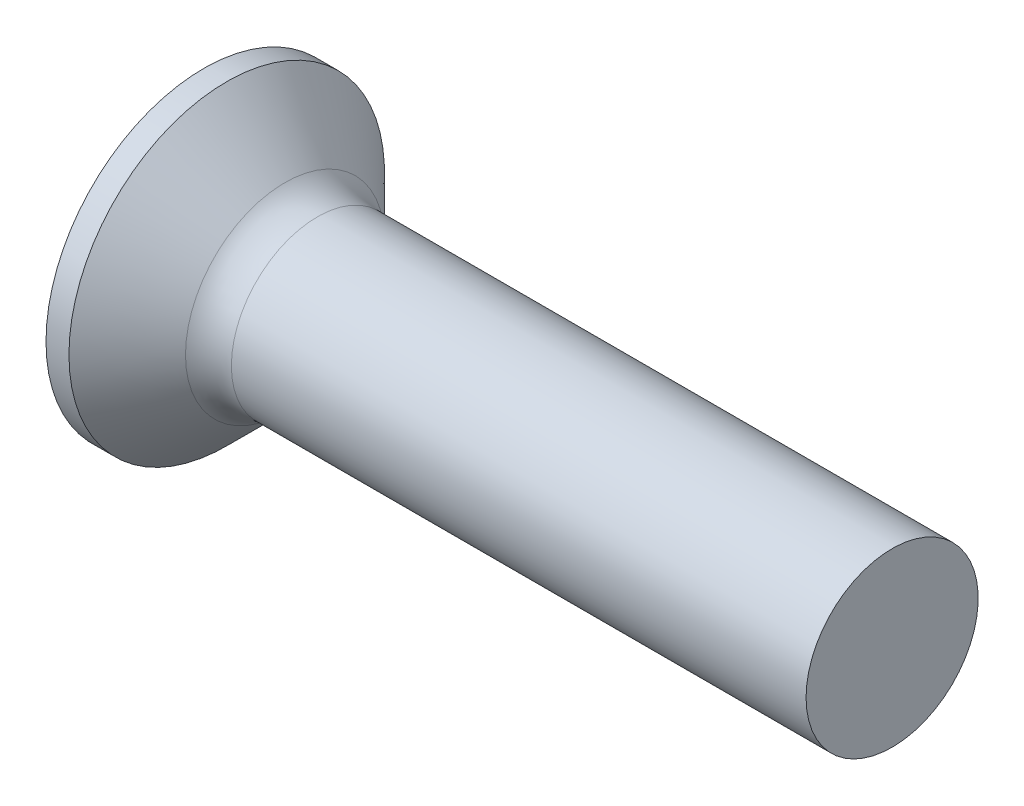
ISO-10303-21;
HEADER;
FILE_DESCRIPTION(('STEP AP214'),'2;1');
FILE_NAME('part.step','',(''),(''),'','','');
FILE_SCHEMA(('AUTOMOTIVE_DESIGN { 1 0 10303 214 1 1 1 1 }'));
ENDSEC;
DATA;
#1=APPLICATION_CONTEXT('core data for automotive mechanical design processes');
#2=APPLICATION_PROTOCOL_DEFINITION('international standard','automotive_design',2000,#1);
#3=PRODUCT_CONTEXT('',#1,'mechanical');
#4=PRODUCT('Part','Part','',(#3));
#5=PRODUCT_RELATED_PRODUCT_CATEGORY('part','',(#4));
#6=PRODUCT_DEFINITION_FORMATION('','',#4);
#7=PRODUCT_DEFINITION_CONTEXT('part definition',#1,'design');
#8=PRODUCT_DEFINITION('design','',#6,#7);
#9=PRODUCT_DEFINITION_SHAPE('','',#8);
#10=(LENGTH_UNIT() NAMED_UNIT(*) SI_UNIT(.MILLI.,.METRE.));
#11=(NAMED_UNIT(*) PLANE_ANGLE_UNIT() SI_UNIT($,.RADIAN.));
#12=(NAMED_UNIT(*) SI_UNIT($,.STERADIAN.) SOLID_ANGLE_UNIT());
#13=UNCERTAINTY_MEASURE_WITH_UNIT(LENGTH_MEASURE(1.E-05),#10,'distance_accuracy_value','');
#14=(GEOMETRIC_REPRESENTATION_CONTEXT(3) GLOBAL_UNCERTAINTY_ASSIGNED_CONTEXT((#13)) GLOBAL_UNIT_ASSIGNED_CONTEXT((#10,
#11,#12)) REPRESENTATION_CONTEXT('',''));
#15=CARTESIAN_POINT('',(0.,0.,0.));
#16=DIRECTION('',(0.,0.,1.));
#17=DIRECTION('',(1.,0.,0.));
#18=AXIS2_PLACEMENT_3D('',#15,#16,#17);
#19=CARTESIAN_POINT('',(2.01,-0.497851135403458,0.37));
#20=DIRECTION('',(0.,0.,-1.));
#21=DIRECTION('',(0.,1.,0.));
#22=AXIS2_PLACEMENT_3D('',#19,#20,#21);
#23=PLANE('',#22);
#24=DIRECTION('',(0.,-1.,0.));
#25=VECTOR('',#24,1.);
#26=CARTESIAN_POINT('',(0.,1.5,0.37));
#27=LINE('',#26,#25);
#28=CARTESIAN_POINT('',(0.,-0.590157547916263,0.37));
#29=VERTEX_POINT('',#28);
#30=CARTESIAN_POINT('',(0.,-1.5,0.37));
#31=VERTEX_POINT('',#30);
#32=EDGE_CURVE('E458',#29,#31,#27,.T.);
#33=ORIENTED_EDGE('',*,*,#32,.F.);
#34=CARTESIAN_POINT('',(-1.01053649699026,-0.672102030078459,0.37));
#35=CARTESIAN_POINT('',(-0.799706058781647,-0.65526709888962,0.37));
#36=CARTESIAN_POINT('',(-0.588886212565098,-0.638297110577309,0.37));
#37=CARTESIAN_POINT('',(-0.167272662573758,-0.603984130523452,0.37));
#38=CARTESIAN_POINT('',(0.043521040593722,-0.586641131327184,0.37));
#39=CARTESIAN_POINT('',(0.465068838236452,-0.551479911668094,0.37));
#40=CARTESIAN_POINT('',(0.675822932725247,-0.533661691368078,0.37));
#41=CARTESIAN_POINT('',(1.09727362087867,-0.497387538868942,0.37));
#42=CARTESIAN_POINT('',(1.30797021528206,-0.478931615293404,0.37));
#43=CARTESIAN_POINT('',(1.67418894765493,-0.446067164114376,0.37));
#44=CARTESIAN_POINT('',(1.82972932594025,-0.431862501020785,0.37));
#45=CARTESIAN_POINT('',(2.14074770367772,-0.402797709732015,0.37));
#46=CARTESIAN_POINT('',(2.29622570364502,-0.38793758706717,0.37));
#47=CARTESIAN_POINT('',(2.60710169356699,-0.357305117929346,0.37));
#48=CARTESIAN_POINT('',(2.76249967848536,-0.341532719782115,0.37));
#49=CARTESIAN_POINT('',(2.99549070750468,-0.316847908272698,0.37));
#50=CARTESIAN_POINT('',(3.07313791127142,-0.308448465888148,0.37));
#51=CARTESIAN_POINT('',(3.22838341584044,-0.291202251038989,0.37));
#52=CARTESIAN_POINT('',(3.30598171607669,-0.282355473489553,0.37));
#53=CARTESIAN_POINT('',(3.38354828471668,-0.273232461280215,0.37));
#54=B_SPLINE_CURVE_WITH_KNOTS('',3,(#34,#35,#36,#37,#38,#39,#40,#41,#42,#43,#44,#45,#46,#47,#48,
#49,#50,#51,#52,#53),.UNSPECIFIED.,.F.,.F.,(4,2,2,2,2,2,2,2,2,4),(0.,0.634504777580944,
1.26902224771403,1.90353950046914,2.53804817608336,3.00661008454961,3.47516804035678,
3.94375256285268,4.17805198347564,4.41235406796206),.UNSPECIFIED.);
#55=CARTESIAN_POINT('',(2.01,-0.415013252800437,0.37));
#56=VERTEX_POINT('',#55);
#57=EDGE_CURVE('E214',#29,#56,#54,.T.);
#58=ORIENTED_EDGE('',*,*,#57,.T.);
#59=DIRECTION('',(0.,-1.,0.));
#60=VECTOR('',#59,1.);
#61=CARTESIAN_POINT('',(2.01,0.497851135403459,0.37));
#62=LINE('',#61,#60);
#63=CARTESIAN_POINT('',(2.01,-0.497851135403458,0.37));
#64=VERTEX_POINT('',#63);
#65=EDGE_CURVE('E367',#56,#64,#62,.T.);
#66=ORIENTED_EDGE('',*,*,#65,.T.);
#67=DIRECTION('',(0.894934391398442,0.446197753347436,0.));
#68=VECTOR('',#67,1.);
#69=CARTESIAN_POINT('',(0.,-1.5,0.37));
#70=LINE('',#69,#68);
#71=EDGE_CURVE('E466',#31,#64,#70,.T.);
#72=ORIENTED_EDGE('',*,*,#71,.F.);
#73=EDGE_LOOP('',(#33,#58,#66,#72));
#74=FACE_BOUND('',#73,.T.);
#75=ADVANCED_FACE('F35',(#74),#23,.T.);
#76=CARTESIAN_POINT('',(2.01,0.497851135403459,0.37));
#77=VERTEX_POINT('',#76);
#78=CARTESIAN_POINT('',(2.01,0.415013252800437,0.37));
#79=VERTEX_POINT('',#78);
#80=EDGE_CURVE('E363',#77,#79,#62,.T.);
#81=ORIENTED_EDGE('',*,*,#80,.T.);
#82=CARTESIAN_POINT('',(-1.01053649691082,0.672102030072117,0.37));
#83=CARTESIAN_POINT('',(-0.79970605871103,0.655267098883947,0.37));
#84=CARTESIAN_POINT('',(-0.588886212503304,0.638297110572311,0.37));
#85=CARTESIAN_POINT('',(-0.16727266252961,0.603984130519827,0.37));
#86=CARTESIAN_POINT('',(0.0435210406290474,0.586641131324258,0.37));
#87=CARTESIAN_POINT('',(0.465068838244709,0.551479911667385,0.37));
#88=CARTESIAN_POINT('',(0.67582293271526,0.533661691368909,0.37));
#89=CARTESIAN_POINT('',(1.09727362083221,0.497387538872971,0.37));
#90=CARTESIAN_POINT('',(1.30797021521736,0.478931615299089,0.37));
#91=CARTESIAN_POINT('',(1.67418894757201,0.446067164121905,0.37));
#92=CARTESIAN_POINT('',(1.82972932585734,0.431862501028414,0.37));
#93=CARTESIAN_POINT('',(2.14074770359484,0.40279770973988,0.37));
#94=CARTESIAN_POINT('',(2.29622570356215,0.38793758707517,0.37));
#95=CARTESIAN_POINT('',(2.60710169348415,0.357305117937676,0.37));
#96=CARTESIAN_POINT('',(2.76249967840253,0.341532719790639,0.37));
#97=CARTESIAN_POINT('',(2.99549070742189,0.316847908281594,0.37));
#98=CARTESIAN_POINT('',(3.07313791118864,0.308448465897182,0.37));
#99=CARTESIAN_POINT('',(3.22838341575769,0.291202251048339,0.37));
#100=CARTESIAN_POINT('',(3.30598171599396,0.282355473499082,0.37));
#101=CARTESIAN_POINT('',(3.38354828463398,0.27323246128995,0.37));
#102=B_SPLINE_CURVE_WITH_KNOTS('',3,(#82,#83,#84,#85,#86,#87,#88,#89,#90,#91,#92,#93,#94,#95,
#96,#97,#98,#99,#100,#101),.UNSPECIFIED.,.F.,.F.,(4,2,2,2,2,2,2,2,2,4),(0.,0.634504777554397,
1.26902224766093,1.90353950036111,2.53804817592041,3.00661008438666,3.47516804019383,
3.94375256268972,4.17805198331267,4.41235406779909),.UNSPECIFIED.);
#103=CARTESIAN_POINT('',(0.,0.590157547916263,0.37));
#104=VERTEX_POINT('',#103);
#105=EDGE_CURVE('E207',#79,#104,#102,.F.);
#106=ORIENTED_EDGE('',*,*,#105,.T.);
#107=CARTESIAN_POINT('',(0.,1.5,0.37));
#108=VERTEX_POINT('',#107);
#109=EDGE_CURVE('E460',#108,#104,#27,.T.);
#110=ORIENTED_EDGE('',*,*,#109,.F.);
#111=DIRECTION('',(0.894934391398442,-0.446197753347436,0.));
#112=VECTOR('',#111,1.);
#113=CARTESIAN_POINT('',(0.,1.5,0.37));
#114=LINE('',#113,#112);
#115=EDGE_CURVE('E58',#108,#77,#114,.T.);
#116=ORIENTED_EDGE('',*,*,#115,.T.);
#117=EDGE_LOOP('',(#81,#106,#110,#116));
#118=FACE_BOUND('',#117,.T.);
#119=ADVANCED_FACE('F189',(#118),#23,.T.);
#120=CARTESIAN_POINT('',(2.01,0.497851135403458,-0.37));
#121=DIRECTION('',(0.,0.,1.));
#122=DIRECTION('',(1.,0.,0.));
#123=AXIS2_PLACEMENT_3D('',#120,#121,#122);
#124=PLANE('',#123);
#125=DIRECTION('',(0.,1.,0.));
#126=VECTOR('',#125,1.);
#127=CARTESIAN_POINT('',(2.01,-0.497851135403459,-0.37));
#128=LINE('',#127,#126);
#129=CARTESIAN_POINT('',(2.01,-0.497851135403459,-0.37));
#130=VERTEX_POINT('',#129);
#131=CARTESIAN_POINT('',(2.01,-0.415013252800437,-0.37));
#132=VERTEX_POINT('',#131);
#133=EDGE_CURVE('E376',#130,#132,#128,.T.);
#134=ORIENTED_EDGE('',*,*,#133,.T.);
#135=CARTESIAN_POINT('',(-1.01053649699026,-0.672102030078459,-0.37));
#136=CARTESIAN_POINT('',(-0.799706058781647,-0.65526709888962,-0.37));
#137=CARTESIAN_POINT('',(-0.588886212565098,-0.638297110577309,-0.37));
#138=CARTESIAN_POINT('',(-0.167272662573758,-0.603984130523452,-0.37));
#139=CARTESIAN_POINT('',(0.043521040593722,-0.586641131327184,-0.37));
#140=CARTESIAN_POINT('',(0.465068838236453,-0.551479911668094,-0.37));
#141=CARTESIAN_POINT('',(0.675822932725247,-0.533661691368078,-0.37));
#142=CARTESIAN_POINT('',(1.09727362087867,-0.497387538868943,-0.37));
#143=CARTESIAN_POINT('',(1.30797021528206,-0.478931615293404,-0.37));
#144=CARTESIAN_POINT('',(1.67418894765493,-0.446067164114376,-0.37));
#145=CARTESIAN_POINT('',(1.82972932594025,-0.431862501020785,-0.37));
#146=CARTESIAN_POINT('',(2.14074770367772,-0.402797709732015,-0.37));
#147=CARTESIAN_POINT('',(2.29622570364502,-0.38793758706717,-0.37));
#148=CARTESIAN_POINT('',(2.60710169356699,-0.357305117929346,-0.37));
#149=CARTESIAN_POINT('',(2.76249967848536,-0.341532719782115,-0.37));
#150=CARTESIAN_POINT('',(2.99549070750468,-0.316847908272698,-0.37));
#151=CARTESIAN_POINT('',(3.07313791127142,-0.308448465888148,-0.37));
#152=CARTESIAN_POINT('',(3.22838341584044,-0.291202251038989,-0.37));
#153=CARTESIAN_POINT('',(3.30598171607669,-0.282355473489553,-0.37));
#154=CARTESIAN_POINT('',(3.38354828471668,-0.273232461280215,-0.37));
#155=B_SPLINE_CURVE_WITH_KNOTS('',3,(#135,#136,#137,#138,#139,#140,#141,#142,#143,#144,#145,
#146,#147,#148,#149,#150,#151,#152,#153,#154),.UNSPECIFIED.,.F.,.F.,(4,2,2,2,2,2,2,2,2,4),(0.,
0.634504777580944,1.26902224771403,1.90353950046914,2.53804817608336,3.00661008454961,
3.47516804035678,3.94375256285268,4.17805198347564,4.41235406796206),.UNSPECIFIED.);
#156=CARTESIAN_POINT('',(0.,-0.590157547916263,-0.37));
#157=VERTEX_POINT('',#156);
#158=EDGE_CURVE('E270',#132,#157,#155,.F.);
#159=ORIENTED_EDGE('',*,*,#158,.T.);
#160=DIRECTION('',(0.,1.,0.));
#161=VECTOR('',#160,1.);
#162=CARTESIAN_POINT('',(0.,-1.5,-0.37));
#163=LINE('',#162,#161);
#164=CARTESIAN_POINT('',(0.,-1.5,-0.37));
#165=VERTEX_POINT('',#164);
#166=EDGE_CURVE('E459',#165,#157,#163,.T.);
#167=ORIENTED_EDGE('',*,*,#166,.F.);
#168=DIRECTION('',(0.894934391398442,0.446197753347436,0.));
#169=VECTOR('',#168,1.);
#170=CARTESIAN_POINT('',(0.,-1.5,-0.37));
#171=LINE('',#170,#169);
#172=EDGE_CURVE('E469',#165,#130,#171,.T.);
#173=ORIENTED_EDGE('',*,*,#172,.T.);
#174=EDGE_LOOP('',(#134,#159,#167,#173));
#175=FACE_BOUND('',#174,.T.);
#176=ADVANCED_FACE('F195',(#175),#124,.T.);
#177=CARTESIAN_POINT('',(0.,0.590157547916263,-0.37));
#178=VERTEX_POINT('',#177);
#179=CARTESIAN_POINT('',(0.,1.5,-0.37));
#180=VERTEX_POINT('',#179);
#181=EDGE_CURVE('E465',#178,#180,#163,.T.);
#182=ORIENTED_EDGE('',*,*,#181,.F.);
#183=CARTESIAN_POINT('',(-1.01053649699026,0.672102030078459,-0.37));
#184=CARTESIAN_POINT('',(-0.799706058781647,0.65526709888962,-0.37));
#185=CARTESIAN_POINT('',(-0.588886212565098,0.638297110577309,-0.37));
#186=CARTESIAN_POINT('',(-0.167272662573758,0.603984130523452,-0.37));
#187=CARTESIAN_POINT('',(0.043521040593722,0.586641131327184,-0.37));
#188=CARTESIAN_POINT('',(0.465068838236453,0.551479911668094,-0.37));
#189=CARTESIAN_POINT('',(0.675822932725247,0.533661691368078,-0.37));
#190=CARTESIAN_POINT('',(1.09727362087867,0.497387538868943,-0.37));
#191=CARTESIAN_POINT('',(1.30797021528206,0.478931615293404,-0.37));
#192=CARTESIAN_POINT('',(1.67418894765493,0.446067164114376,-0.37));
#193=CARTESIAN_POINT('',(1.82972932594025,0.431862501020785,-0.37));
#194=CARTESIAN_POINT('',(2.14074770367772,0.402797709732015,-0.37));
#195=CARTESIAN_POINT('',(2.29622570364502,0.38793758706717,-0.37));
#196=CARTESIAN_POINT('',(2.60710169356699,0.357305117929346,-0.37));
#197=CARTESIAN_POINT('',(2.76249967848536,0.341532719782115,-0.37));
#198=CARTESIAN_POINT('',(2.99549070750468,0.316847908272698,-0.37));
#199=CARTESIAN_POINT('',(3.07313791127142,0.308448465888148,-0.37));
#200=CARTESIAN_POINT('',(3.22838341584044,0.291202251038989,-0.37));
#201=CARTESIAN_POINT('',(3.30598171607669,0.282355473489553,-0.37));
#202=CARTESIAN_POINT('',(3.38354828471668,0.273232461280215,-0.37));
#203=B_SPLINE_CURVE_WITH_KNOTS('',3,(#183,#184,#185,#186,#187,#188,#189,#190,#191,#192,#193,
#194,#195,#196,#197,#198,#199,#200,#201,#202),.UNSPECIFIED.,.F.,.F.,(4,2,2,2,2,2,2,2,2,4),(0.,
0.634504777580944,1.26902224771403,1.90353950046914,2.53804817608336,3.00661008454961,
3.47516804035678,3.94375256285268,4.17805198347564,4.41235406796206),.UNSPECIFIED.);
#204=CARTESIAN_POINT('',(2.01,0.415013252800437,-0.37));
#205=VERTEX_POINT('',#204);
#206=EDGE_CURVE('E264',#178,#205,#203,.T.);
#207=ORIENTED_EDGE('',*,*,#206,.T.);
#208=CARTESIAN_POINT('',(2.01,0.497851135403459,-0.37));
#209=VERTEX_POINT('',#208);
#210=EDGE_CURVE('E378',#205,#209,#128,.T.);
#211=ORIENTED_EDGE('',*,*,#210,.T.);
#212=DIRECTION('',(0.894934391398442,-0.446197753347436,0.));
#213=VECTOR('',#212,1.);
#214=CARTESIAN_POINT('',(0.,1.5,-0.37));
#215=LINE('',#214,#213);
#216=EDGE_CURVE('E375',#180,#209,#215,.T.);
#217=ORIENTED_EDGE('',*,*,#216,.F.);
#218=EDGE_LOOP('',(#182,#207,#211,#217));
#219=FACE_BOUND('',#218,.T.);
#220=ADVANCED_FACE('F476',(#219),#124,.T.);
#221=CARTESIAN_POINT('',(2.01,0.497851135403459,-0.37));
#222=DIRECTION('',(1.,0.,0.));
#223=DIRECTION('',(0.,0.,-1.));
#224=AXIS2_PLACEMENT_3D('',#221,#222,#223);
#225=PLANE('',#224);
#226=CARTESIAN_POINT('',(2.01,0.,0.));
#227=DIRECTION('',(-1.,0.,0.));
#228=DIRECTION('',(0.,0.,1.));
#229=AXIS2_PLACEMENT_3D('',#226,#227,#228);
#230=CIRCLE('',#229,0.555999999999999);
#231=CARTESIAN_POINT('',(2.01,-0.24754847399547,-0.497851135403459));
#232=VERTEX_POINT('',#231);
#233=CARTESIAN_POINT('',(2.01,-0.369999999999999,-0.415013252800438));
#234=VERTEX_POINT('',#233);
#235=EDGE_CURVE('E342',#232,#234,#230,.T.);
#236=ORIENTED_EDGE('',*,*,#235,.F.);
#237=DIRECTION('',(0.,1.,0.));
#238=VECTOR('',#237,1.);
#239=CARTESIAN_POINT('',(2.01,-0.369999999999998,-0.49785113540346));
#240=LINE('',#239,#238);
#241=CARTESIAN_POINT('',(2.01,-0.369999999999998,-0.49785113540346));
#242=VERTEX_POINT('',#241);
#243=EDGE_CURVE('E443',#242,#232,#240,.T.);
#244=ORIENTED_EDGE('',*,*,#243,.F.);
#245=DIRECTION('',(0.,0.,-1.));
#246=VECTOR('',#245,1.);
#247=CARTESIAN_POINT('',(2.01,-0.370000000000002,0.497851135403457));
#248=LINE('',#247,#246);
#249=EDGE_CURVE('E447',#234,#242,#248,.T.);
#250=ORIENTED_EDGE('',*,*,#249,.F.);
#251=EDGE_LOOP('',(#236,#244,#250));
#252=FACE_BOUND('',#251,.T.);
#253=ADVANCED_FACE('F489',(#252),#225,.F.);
#254=CARTESIAN_POINT('',(2.01,-0.497851135403459,-0.247548473995471));
#255=VERTEX_POINT('',#254);
#256=EDGE_CURVE('E337',#132,#255,#230,.T.);
#257=ORIENTED_EDGE('',*,*,#256,.F.);
#258=ORIENTED_EDGE('',*,*,#133,.F.);
#259=DIRECTION('',(0.,0.,-1.));
#260=VECTOR('',#259,1.);
#261=CARTESIAN_POINT('',(2.01,-0.497851135403458,0.37));
#262=LINE('',#261,#260);
#263=EDGE_CURVE('E366',#255,#130,#262,.T.);
#264=ORIENTED_EDGE('',*,*,#263,.F.);
#265=EDGE_LOOP('',(#257,#258,#264));
#266=FACE_BOUND('',#265,.T.);
#267=ADVANCED_FACE('F495',(#266),#225,.F.);
#268=CARTESIAN_POINT('',(2.01,-0.497851135403458,0.247548473995471));
#269=VERTEX_POINT('',#268);
#270=EDGE_CURVE('E332',#269,#56,#230,.T.);
#271=ORIENTED_EDGE('',*,*,#270,.F.);
#272=EDGE_CURVE('E369',#64,#269,#262,.T.);
#273=ORIENTED_EDGE('',*,*,#272,.F.);
#274=ORIENTED_EDGE('',*,*,#65,.F.);
#275=EDGE_LOOP('',(#271,#273,#274));
#276=FACE_BOUND('',#275,.T.);
#277=ADVANCED_FACE('F501',(#276),#225,.F.);
#278=CARTESIAN_POINT('',(2.01,-0.370000000000001,0.415013252800435));
#279=VERTEX_POINT('',#278);
#280=CARTESIAN_POINT('',(2.01,-0.247548473995473,0.497851135403458));
#281=VERTEX_POINT('',#280);
#282=EDGE_CURVE('E50',#279,#281,#230,.T.);
#283=ORIENTED_EDGE('',*,*,#282,.F.);
#284=CARTESIAN_POINT('',(2.01,-0.370000000000002,0.497851135403457));
#285=VERTEX_POINT('',#284);
#286=EDGE_CURVE('E449',#285,#279,#248,.T.);
#287=ORIENTED_EDGE('',*,*,#286,.F.);
#288=DIRECTION('',(0.,-1.,0.));
#289=VECTOR('',#288,1.);
#290=CARTESIAN_POINT('',(2.01,0.369999999999998,0.49785113540346));
#291=LINE('',#290,#289);
#292=EDGE_CURVE('E448',#281,#285,#291,.T.);
#293=ORIENTED_EDGE('',*,*,#292,.F.);
#294=EDGE_LOOP('',(#283,#287,#293));
#295=FACE_BOUND('',#294,.T.);
#296=ADVANCED_FACE('F528',(#295),#225,.F.);
#297=CARTESIAN_POINT('',(2.01,0.247548473995469,0.497851135403459));
#298=VERTEX_POINT('',#297);
#299=CARTESIAN_POINT('',(2.01,0.369999999999999,0.415013252800438));
#300=VERTEX_POINT('',#299);
#301=EDGE_CURVE('E323',#298,#300,#230,.T.);
#302=ORIENTED_EDGE('',*,*,#301,.F.);
#303=CARTESIAN_POINT('',(2.01,0.369999999999998,0.49785113540346));
#304=VERTEX_POINT('',#303);
#305=EDGE_CURVE('E444',#304,#298,#291,.T.);
#306=ORIENTED_EDGE('',*,*,#305,.F.);
#307=DIRECTION('',(0.,0.,1.));
#308=VECTOR('',#307,1.);
#309=CARTESIAN_POINT('',(2.01,0.370000000000002,-0.497851135403457));
#310=LINE('',#309,#308);
#311=EDGE_CURVE('E221',#300,#304,#310,.T.);
#312=ORIENTED_EDGE('',*,*,#311,.F.);
#313=EDGE_LOOP('',(#302,#306,#312));
#314=FACE_BOUND('',#313,.T.);
#315=ADVANCED_FACE('F485',(#314),#225,.F.);
#316=CARTESIAN_POINT('',(2.01,0.497851135403459,0.247548473995471));
#317=VERTEX_POINT('',#316);
#318=EDGE_CURVE('E330',#79,#317,#230,.T.);
#319=ORIENTED_EDGE('',*,*,#318,.F.);
#320=ORIENTED_EDGE('',*,*,#80,.F.);
#321=DIRECTION('',(0.,0.,1.));
#322=VECTOR('',#321,1.);
#323=CARTESIAN_POINT('',(2.01,0.497851135403459,-0.37));
#324=LINE('',#323,#322);
#325=EDGE_CURVE('E364',#317,#77,#324,.T.);
#326=ORIENTED_EDGE('',*,*,#325,.F.);
#327=EDGE_LOOP('',(#319,#320,#326));
#328=FACE_BOUND('',#327,.T.);
#329=ADVANCED_FACE('F362',(#328),#225,.F.);
#330=CARTESIAN_POINT('',(2.01,0.497851135403459,-0.247548473995471));
#331=VERTEX_POINT('',#330);
#332=EDGE_CURVE('E352',#331,#205,#230,.T.);
#333=ORIENTED_EDGE('',*,*,#332,.F.);
#334=EDGE_CURVE('E371',#209,#331,#324,.T.);
#335=ORIENTED_EDGE('',*,*,#334,.F.);
#336=ORIENTED_EDGE('',*,*,#210,.F.);
#337=EDGE_LOOP('',(#333,#335,#336));
#338=FACE_BOUND('',#337,.T.);
#339=ADVANCED_FACE('F478',(#338),#225,.F.);
#340=CARTESIAN_POINT('',(2.01,-0.497851135403459,-0.37));
#341=DIRECTION('',(-0.446197753347436,0.894934391398443,0.));
#342=DIRECTION('',(-0.894934391398442,-0.446197753347436,0.));
#343=AXIS2_PLACEMENT_3D('',#340,#341,#342);
#344=PLANE('',#343);
#345=ORIENTED_EDGE('',*,*,#272,.T.);
#346=CARTESIAN_POINT('',(2.86902919914418,-0.0695550475538962,0.));
#347=DIRECTION('',(-0.446197753347436,0.894934391398443,0.));
#348=DIRECTION('',(-0.894934391398443,-0.446197753347436,0.));
#349=AXIS2_PLACEMENT_3D('',#346,#347,#348);
#350=ELLIPSE('',#349,1.11145971268776,0.491029001453358);
#351=EDGE_CURVE('E282',#269,#255,#350,.F.);
#352=ORIENTED_EDGE('',*,*,#351,.T.);
#353=ORIENTED_EDGE('',*,*,#263,.T.);
#354=ORIENTED_EDGE('',*,*,#172,.F.);
#355=DIRECTION('',(0.,0.,-1.));
#356=VECTOR('',#355,1.);
#357=CARTESIAN_POINT('',(0.,-1.5,0.37));
#358=LINE('',#357,#356);
#359=EDGE_CURVE('E383',#31,#165,#358,.T.);
#360=ORIENTED_EDGE('',*,*,#359,.F.);
#361=ORIENTED_EDGE('',*,*,#71,.T.);
#362=EDGE_LOOP('',(#345,#352,#353,#354,#360,#361));
#363=FACE_BOUND('',#362,.T.);
#364=ADVANCED_FACE('F201',(#363),#344,.T.);
#365=CARTESIAN_POINT('',(2.01,0.497851135403459,0.37));
#366=DIRECTION('',(-0.446197753347436,-0.894934391398443,0.));
#367=DIRECTION('',(0.894934391398442,-0.446197753347436,0.));
#368=AXIS2_PLACEMENT_3D('',#365,#366,#367);
#369=PLANE('',#368);
#370=ORIENTED_EDGE('',*,*,#334,.T.);
#371=CARTESIAN_POINT('',(2.86902919914418,0.0695550475538963,0.));
#372=DIRECTION('',(-0.446197753347436,-0.894934391398443,0.));
#373=DIRECTION('',(-0.894934391398443,0.446197753347436,0.));
#374=AXIS2_PLACEMENT_3D('',#371,#372,#373);
#375=ELLIPSE('',#374,1.11145971268776,0.491029001453358);
#376=EDGE_CURVE('E287',#331,#317,#375,.F.);
#377=ORIENTED_EDGE('',*,*,#376,.T.);
#378=ORIENTED_EDGE('',*,*,#325,.T.);
#379=ORIENTED_EDGE('',*,*,#115,.F.);
#380=DIRECTION('',(0.,0.,1.));
#381=VECTOR('',#380,1.);
#382=CARTESIAN_POINT('',(0.,1.5,-0.37));
#383=LINE('',#382,#381);
#384=EDGE_CURVE('E455',#180,#108,#383,.T.);
#385=ORIENTED_EDGE('',*,*,#384,.F.);
#386=ORIENTED_EDGE('',*,*,#216,.T.);
#387=EDGE_LOOP('',(#370,#377,#378,#379,#385,#386));
#388=FACE_BOUND('',#387,.T.);
#389=ADVANCED_FACE('F474',(#388),#369,.T.);
#390=CARTESIAN_POINT('',(2.01,0.369999999999998,0.49785113540346));
#391=DIRECTION('',(0.,-1.,0.));
#392=DIRECTION('',(1.,0.,0.));
#393=AXIS2_PLACEMENT_3D('',#390,#391,#392);
#394=PLANE('',#393);
#395=CARTESIAN_POINT('',(2.01,0.370000000000002,-0.497851135403457));
#396=VERTEX_POINT('',#395);
#397=CARTESIAN_POINT('',(2.01,0.370000000000001,-0.415013252800435));
#398=VERTEX_POINT('',#397);
#399=EDGE_CURVE('E453',#396,#398,#310,.T.);
#400=ORIENTED_EDGE('',*,*,#399,.T.);
#401=CARTESIAN_POINT('',(-1.01053649691082,0.370000000000002,-0.672102030072116));
#402=CARTESIAN_POINT('',(-0.799706058711029,0.370000000000002,-0.655267098883946));
#403=CARTESIAN_POINT('',(-0.588886212503304,0.370000000000002,-0.63829711057231));
#404=CARTESIAN_POINT('',(-0.16727266252961,0.370000000000002,-0.603984130519826));
#405=CARTESIAN_POINT('',(0.0435210406290472,0.370000000000002,-0.586641131324257));
#406=CARTESIAN_POINT('',(0.465068838244709,0.370000000000002,-0.551479911667383));
#407=CARTESIAN_POINT('',(0.67582293271526,0.370000000000002,-0.533661691368908));
#408=CARTESIAN_POINT('',(1.09727362083221,0.370000000000002,-0.497387538872969));
#409=CARTESIAN_POINT('',(1.30797021521736,0.370000000000001,-0.478931615299088));
#410=CARTESIAN_POINT('',(1.67418894757201,0.370000000000001,-0.446067164121904));
#411=CARTESIAN_POINT('',(1.82972932585734,0.370000000000001,-0.431862501028413));
#412=CARTESIAN_POINT('',(2.14074770359484,0.370000000000001,-0.402797709739878));
#413=CARTESIAN_POINT('',(2.29622570356215,0.370000000000001,-0.387937587075169));
#414=CARTESIAN_POINT('',(2.60710169348415,0.370000000000001,-0.357305117937675));
#415=CARTESIAN_POINT('',(2.76249967840253,0.370000000000001,-0.341532719790638));
#416=CARTESIAN_POINT('',(2.99549070742189,0.370000000000001,-0.316847908281593));
#417=CARTESIAN_POINT('',(3.07313791118864,0.370000000000001,-0.308448465897181));
#418=CARTESIAN_POINT('',(3.22838341575769,0.370000000000001,-0.291202251048338));
#419=CARTESIAN_POINT('',(3.30598171599396,0.370000000000001,-0.282355473499081));
#420=CARTESIAN_POINT('',(3.38354828463398,0.370000000000001,-0.273232461289949));
#421=B_SPLINE_CURVE_WITH_KNOTS('',3,(#401,#402,#403,#404,#405,#406,#407,#408,#409,#410,#411,
#412,#413,#414,#415,#416,#417,#418,#419,#420),.UNSPECIFIED.,.F.,.F.,(4,2,2,2,2,2,2,2,2,4),(0.,
0.634504777554396,1.26902224766093,1.90353950036111,2.53804817592041,3.00661008438666,
3.47516804019383,3.94375256268972,4.17805198331267,4.41235406779909),.UNSPECIFIED.);
#422=CARTESIAN_POINT('',(0.,0.370000000000002,-0.590157547916261));
#423=VERTEX_POINT('',#422);
#424=EDGE_CURVE('E256',#398,#423,#421,.F.);
#425=ORIENTED_EDGE('',*,*,#424,.T.);
#426=DIRECTION('',(0.,0.,1.));
#427=VECTOR('',#426,1.);
#428=CARTESIAN_POINT('',(0.,0.370000000000005,-1.5));
#429=LINE('',#428,#427);
#430=CARTESIAN_POINT('',(0.,0.370000000000005,-1.5));
#431=VERTEX_POINT('',#430);
#432=EDGE_CURVE('E429',#431,#423,#429,.T.);
#433=ORIENTED_EDGE('',*,*,#432,.F.);
#434=DIRECTION('',(0.894934391398442,0.,0.446197753347436));
#435=VECTOR('',#434,1.);
#436=CARTESIAN_POINT('',(0.,0.370000000000005,-1.5));
#437=LINE('',#436,#435);
#438=EDGE_CURVE('E435',#431,#396,#437,.T.);
#439=ORIENTED_EDGE('',*,*,#438,.T.);
#440=EDGE_LOOP('',(#400,#425,#433,#439));
#441=FACE_BOUND('',#440,.T.);
#442=ADVANCED_FACE('F608',(#441),#394,.T.);
#443=CARTESIAN_POINT('',(2.01,-0.369999999999998,-0.497851135403459));
#444=DIRECTION('',(0.,1.,0.));
#445=DIRECTION('',(0.,0.,1.));
#446=AXIS2_PLACEMENT_3D('',#443,#444,#445);
#447=PLANE('',#446);
#448=DIRECTION('',(0.,0.,-1.));
#449=VECTOR('',#448,1.);
#450=CARTESIAN_POINT('',(0.,-0.370000000000005,1.5));
#451=LINE('',#450,#449);
#452=CARTESIAN_POINT('',(0.,-0.369999999999998,-0.590157547916264));
#453=VERTEX_POINT('',#452);
#454=CARTESIAN_POINT('',(0.,-0.369999999999995,-1.5));
#455=VERTEX_POINT('',#454);
#456=EDGE_CURVE('E425',#453,#455,#451,.T.);
#457=ORIENTED_EDGE('',*,*,#456,.F.);
#458=CARTESIAN_POINT('',(-1.01053649691082,-0.369999999999998,-0.672102030072118));
#459=CARTESIAN_POINT('',(-0.799706058711029,-0.369999999999998,-0.655267098883948));
#460=CARTESIAN_POINT('',(-0.588886212503304,-0.369999999999998,-0.638297110572312));
#461=CARTESIAN_POINT('',(-0.16727266252961,-0.369999999999998,-0.603984130519829));
#462=CARTESIAN_POINT('',(0.0435210406290476,-0.369999999999998,-0.586641131324259));
#463=CARTESIAN_POINT('',(0.465068838244709,-0.369999999999998,-0.551479911667386));
#464=CARTESIAN_POINT('',(0.67582293271526,-0.369999999999998,-0.53366169136891));
#465=CARTESIAN_POINT('',(1.09727362083221,-0.369999999999998,-0.497387538872972));
#466=CARTESIAN_POINT('',(1.30797021521736,-0.369999999999998,-0.47893161529909));
#467=CARTESIAN_POINT('',(1.67418894757201,-0.369999999999999,-0.446067164121906));
#468=CARTESIAN_POINT('',(1.82972932585734,-0.369999999999999,-0.431862501028415));
#469=CARTESIAN_POINT('',(2.14074770359484,-0.369999999999999,-0.402797709739881));
#470=CARTESIAN_POINT('',(2.29622570356215,-0.369999999999999,-0.387937587075171));
#471=CARTESIAN_POINT('',(2.60710169348415,-0.369999999999999,-0.357305117937677));
#472=CARTESIAN_POINT('',(2.76249967840253,-0.369999999999999,-0.341532719790641));
#473=CARTESIAN_POINT('',(2.99549070742189,-0.369999999999999,-0.316847908281595));
#474=CARTESIAN_POINT('',(3.07313791118864,-0.369999999999999,-0.308448465897183));
#475=CARTESIAN_POINT('',(3.22838341575769,-0.369999999999999,-0.29120225104834));
#476=CARTESIAN_POINT('',(3.30598171599396,-0.369999999999999,-0.282355473499083));
#477=CARTESIAN_POINT('',(3.38354828463398,-0.369999999999999,-0.273232461289952));
#478=B_SPLINE_CURVE_WITH_KNOTS('',3,(#458,#459,#460,#461,#462,#463,#464,#465,#466,#467,#468,
#469,#470,#471,#472,#473,#474,#475,#476,#477),.UNSPECIFIED.,.F.,.F.,(4,2,2,2,2,2,2,2,2,4),(0.,
0.634504777554396,1.26902224766093,1.90353950036111,2.53804817592041,3.00661008438666,
3.47516804019383,3.94375256268972,4.17805198331267,4.41235406779909),.UNSPECIFIED.);
#479=EDGE_CURVE('E249',#453,#234,#478,.T.);
#480=ORIENTED_EDGE('',*,*,#479,.T.);
#481=ORIENTED_EDGE('',*,*,#249,.T.);
#482=DIRECTION('',(0.894934391398442,0.,0.446197753347436));
#483=VECTOR('',#482,1.);
#484=CARTESIAN_POINT('',(0.,-0.369999999999995,-1.5));
#485=LINE('',#484,#483);
#486=EDGE_CURVE('E432',#455,#242,#485,.T.);
#487=ORIENTED_EDGE('',*,*,#486,.F.);
#488=EDGE_LOOP('',(#457,#480,#481,#487));
#489=FACE_BOUND('',#488,.T.);
#490=ADVANCED_FACE('F506',(#489),#447,.T.);
#491=CARTESIAN_POINT('',(2.01,0.370000000000002,-0.497851135403457));
#492=DIRECTION('',(-0.446197753347436,0.,0.894934391398443));
#493=DIRECTION('',(-0.894934391398442,0.,-0.446197753347436));
#494=AXIS2_PLACEMENT_3D('',#491,#492,#493);
#495=PLANE('',#494);
#496=ORIENTED_EDGE('',*,*,#243,.T.);
#497=CARTESIAN_POINT('',(2.86902919914418,0.,-0.0695550475538963));
#498=DIRECTION('',(-0.446197753347436,0.,0.894934391398443));
#499=DIRECTION('',(-0.894934391398443,0.,-0.446197753347436));
#500=AXIS2_PLACEMENT_3D('',#497,#498,#499);
#501=ELLIPSE('',#500,1.11145971268776,0.491029001453358);
#502=CARTESIAN_POINT('',(2.01,0.247548473995473,-0.497851135403458));
#503=VERTEX_POINT('',#502);
#504=EDGE_CURVE('E300',#232,#503,#501,.F.);
#505=ORIENTED_EDGE('',*,*,#504,.T.);
#506=EDGE_CURVE('E451',#503,#396,#240,.T.);
#507=ORIENTED_EDGE('',*,*,#506,.T.);
#508=ORIENTED_EDGE('',*,*,#438,.F.);
#509=DIRECTION('',(0.,1.,0.));
#510=VECTOR('',#509,1.);
#511=CARTESIAN_POINT('',(0.,-0.369999999999995,-1.5));
#512=LINE('',#511,#510);
#513=EDGE_CURVE('E424',#455,#431,#512,.T.);
#514=ORIENTED_EDGE('',*,*,#513,.F.);
#515=ORIENTED_EDGE('',*,*,#486,.T.);
#516=EDGE_LOOP('',(#496,#505,#507,#508,#514,#515));
#517=FACE_BOUND('',#516,.T.);
#518=ADVANCED_FACE('F226',(#517),#495,.T.);
#519=ORIENTED_EDGE('',*,*,#286,.T.);
#520=CARTESIAN_POINT('',(-1.01053649699026,-0.370000000000002,0.672102030078457));
#521=CARTESIAN_POINT('',(-0.799706058781647,-0.370000000000002,0.655267098889619));
#522=CARTESIAN_POINT('',(-0.588886212565098,-0.370000000000002,0.638297110577308));
#523=CARTESIAN_POINT('',(-0.167272662573758,-0.370000000000002,0.603984130523451));
#524=CARTESIAN_POINT('',(0.0435210405937219,-0.370000000000002,0.586641131327183));
#525=CARTESIAN_POINT('',(0.465068838236453,-0.370000000000002,0.551479911668092));
#526=CARTESIAN_POINT('',(0.675822932725247,-0.370000000000002,0.533661691368077));
#527=CARTESIAN_POINT('',(1.09727362087867,-0.370000000000002,0.497387538868941));
#528=CARTESIAN_POINT('',(1.30797021528206,-0.370000000000002,0.478931615293402));
#529=CARTESIAN_POINT('',(1.67418894765493,-0.370000000000002,0.446067164114374));
#530=CARTESIAN_POINT('',(1.82972932594024,-0.370000000000002,0.431862501020784));
#531=CARTESIAN_POINT('',(2.14074770367772,-0.370000000000001,0.402797709732014));
#532=CARTESIAN_POINT('',(2.29622570364502,-0.370000000000001,0.387937587067169));
#533=CARTESIAN_POINT('',(2.60710169356699,-0.370000000000001,0.357305117929345));
#534=CARTESIAN_POINT('',(2.76249967848536,-0.370000000000001,0.341532719782114));
#535=CARTESIAN_POINT('',(2.99549070750468,-0.370000000000001,0.316847908272696));
#536=CARTESIAN_POINT('',(3.07313791127142,-0.370000000000001,0.308448465888147));
#537=CARTESIAN_POINT('',(3.22838341584044,-0.370000000000001,0.291202251038988));
#538=CARTESIAN_POINT('',(3.30598171607669,-0.370000000000001,0.282355473489552));
#539=CARTESIAN_POINT('',(3.38354828471668,-0.370000000000001,0.273232461280214));
#540=B_SPLINE_CURVE_WITH_KNOTS('',3,(#520,#521,#522,#523,#524,#525,#526,#527,#528,#529,#530,
#531,#532,#533,#534,#535,#536,#537,#538,#539),.UNSPECIFIED.,.F.,.F.,(4,2,2,2,2,2,2,2,2,4),(0.,
0.634504777580944,1.26902224771403,1.90353950046914,2.53804817608336,3.00661008454961,
3.47516804035678,3.94375256285268,4.17805198347564,4.41235406796206),.UNSPECIFIED.);
#541=CARTESIAN_POINT('',(0.,-0.370000000000002,0.590157547916261));
#542=VERTEX_POINT('',#541);
#543=EDGE_CURVE('E241',#279,#542,#540,.F.);
#544=ORIENTED_EDGE('',*,*,#543,.T.);
#545=CARTESIAN_POINT('',(0.,-0.370000000000005,1.5));
#546=VERTEX_POINT('',#545);
#547=EDGE_CURVE('E420',#546,#542,#451,.T.);
#548=ORIENTED_EDGE('',*,*,#547,.F.);
#549=DIRECTION('',(0.894934391398442,0.,-0.446197753347436));
#550=VECTOR('',#549,1.);
#551=CARTESIAN_POINT('',(0.,-0.370000000000005,1.5));
#552=LINE('',#551,#550);
#553=EDGE_CURVE('E438',#546,#285,#552,.T.);
#554=ORIENTED_EDGE('',*,*,#553,.T.);
#555=EDGE_LOOP('',(#519,#544,#548,#554));
#556=FACE_BOUND('',#555,.T.);
#557=ADVANCED_FACE('F526',(#556),#447,.T.);
#558=CARTESIAN_POINT('',(0.,0.369999999999998,0.590157547916264));
#559=VERTEX_POINT('',#558);
#560=CARTESIAN_POINT('',(0.,0.369999999999994,1.5));
#561=VERTEX_POINT('',#560);
#562=EDGE_CURVE('E431',#559,#561,#429,.T.);
#563=ORIENTED_EDGE('',*,*,#562,.F.);
#564=CARTESIAN_POINT('',(-1.01053649691082,0.369999999999997,0.672102030072119));
#565=CARTESIAN_POINT('',(-0.799706058711029,0.369999999999997,0.655267098883948));
#566=CARTESIAN_POINT('',(-0.588886212503303,0.369999999999997,0.638297110572312));
#567=CARTESIAN_POINT('',(-0.16727266252961,0.369999999999998,0.603984130519829));
#568=CARTESIAN_POINT('',(0.0435210406290474,0.369999999999998,0.586641131324259));
#569=CARTESIAN_POINT('',(0.46506883824471,0.369999999999998,0.551479911667386));
#570=CARTESIAN_POINT('',(0.67582293271526,0.369999999999998,0.53366169136891));
#571=CARTESIAN_POINT('',(1.09727362083221,0.369999999999998,0.497387538872972));
#572=CARTESIAN_POINT('',(1.30797021521736,0.369999999999998,0.47893161529909));
#573=CARTESIAN_POINT('',(1.67418894757201,0.369999999999998,0.446067164121907));
#574=CARTESIAN_POINT('',(1.82972932585734,0.369999999999998,0.431862501028415));
#575=CARTESIAN_POINT('',(2.14074770359484,0.369999999999999,0.402797709739881));
#576=CARTESIAN_POINT('',(2.29622570356215,0.369999999999999,0.387937587075171));
#577=CARTESIAN_POINT('',(2.60710169348415,0.369999999999999,0.357305117937678));
#578=CARTESIAN_POINT('',(2.76249967840253,0.369999999999999,0.341532719790641));
#579=CARTESIAN_POINT('',(2.99549070742189,0.369999999999999,0.316847908281596));
#580=CARTESIAN_POINT('',(3.07313791118864,0.369999999999999,0.308448465897183));
#581=CARTESIAN_POINT('',(3.22838341575769,0.369999999999999,0.29120225104834));
#582=CARTESIAN_POINT('',(3.30598171599396,0.369999999999999,0.282355473499084));
#583=CARTESIAN_POINT('',(3.38354828463398,0.369999999999999,0.273232461289952));
#584=B_SPLINE_CURVE_WITH_KNOTS('',3,(#564,#565,#566,#567,#568,#569,#570,#571,#572,#573,#574,
#575,#576,#577,#578,#579,#580,#581,#582,#583),.UNSPECIFIED.,.F.,.F.,(4,2,2,2,2,2,2,2,2,4),(0.,
0.634504777554396,1.26902224766093,1.90353950036111,2.53804817592041,3.00661008438666,
3.47516804019383,3.94375256268972,4.17805198331267,4.41235406779909),.UNSPECIFIED.);
#585=EDGE_CURVE('E231',#559,#300,#584,.T.);
#586=ORIENTED_EDGE('',*,*,#585,.T.);
#587=ORIENTED_EDGE('',*,*,#311,.T.);
#588=DIRECTION('',(0.894934391398442,0.,-0.446197753347436));
#589=VECTOR('',#588,1.);
#590=CARTESIAN_POINT('',(0.,0.369999999999994,1.5));
#591=LINE('',#590,#589);
#592=EDGE_CURVE('E440',#561,#304,#591,.T.);
#593=ORIENTED_EDGE('',*,*,#592,.F.);
#594=EDGE_LOOP('',(#563,#586,#587,#593));
#595=FACE_BOUND('',#594,.T.);
#596=ADVANCED_FACE('F521',(#595),#394,.T.);
#597=CARTESIAN_POINT('',(2.01,-0.370000000000002,0.497851135403457));
#598=DIRECTION('',(-0.446197753347436,0.,-0.894934391398443));
#599=DIRECTION('',(0.894934391398442,0.,-0.446197753347436));
#600=AXIS2_PLACEMENT_3D('',#597,#598,#599);
#601=PLANE('',#600);
#602=ORIENTED_EDGE('',*,*,#305,.T.);
#603=CARTESIAN_POINT('',(2.86902919914418,0.,0.0695550475538963));
#604=DIRECTION('',(-0.446197753347436,0.,-0.894934391398443));
#605=DIRECTION('',(-0.894934391398443,0.,0.446197753347436));
#606=AXIS2_PLACEMENT_3D('',#603,#604,#605);
#607=ELLIPSE('',#606,1.11145971268776,0.491029001453358);
#608=EDGE_CURVE('E11',#298,#281,#607,.F.);
#609=ORIENTED_EDGE('',*,*,#608,.T.);
#610=ORIENTED_EDGE('',*,*,#292,.T.);
#611=ORIENTED_EDGE('',*,*,#553,.F.);
#612=DIRECTION('',(0.,-1.,0.));
#613=VECTOR('',#612,1.);
#614=CARTESIAN_POINT('',(0.,0.369999999999994,1.5));
#615=LINE('',#614,#613);
#616=EDGE_CURVE('E222',#561,#546,#615,.T.);
#617=ORIENTED_EDGE('',*,*,#616,.F.);
#618=ORIENTED_EDGE('',*,*,#592,.T.);
#619=EDGE_LOOP('',(#602,#609,#610,#611,#617,#618));
#620=FACE_BOUND('',#619,.T.);
#621=ADVANCED_FACE('F418',(#620),#601,.T.);
#622=CARTESIAN_POINT('',(0.,0.,0.));
#623=DIRECTION('',(-1.,0.,0.));
#624=DIRECTION('',(0.,0.,1.));
#625=AXIS2_PLACEMENT_3D('',#622,#623,#624);
#626=PLANE('',#625);
#627=CARTESIAN_POINT('',(0.,0.,0.));
#628=DIRECTION('',(-1.,0.,0.));
#629=DIRECTION('',(0.,0.,1.));
#630=AXIS2_PLACEMENT_3D('',#627,#628,#629);
#631=CIRCLE('',#630,2.75);
#632=CARTESIAN_POINT('',(0.,0.,2.75));
#633=VERTEX_POINT('',#632);
#634=EDGE_CURVE('E386',#633,#633,#631,.T.);
#635=ORIENTED_EDGE('',*,*,#634,.T.);
#636=EDGE_LOOP('',(#635));
#637=FACE_BOUND('',#636,.T.);
#638=ORIENTED_EDGE('',*,*,#547,.T.);
#639=CARTESIAN_POINT('',(0.,0.,0.));
#640=DIRECTION('',(-1.,0.,0.));
#641=DIRECTION('',(0.,0.,1.));
#642=AXIS2_PLACEMENT_3D('',#639,#640,#641);
#643=CIRCLE('',#642,0.69655289200644);
#644=EDGE_CURVE('E318',#29,#542,#643,.T.);
#645=ORIENTED_EDGE('',*,*,#644,.F.);
#646=ORIENTED_EDGE('',*,*,#32,.T.);
#647=ORIENTED_EDGE('',*,*,#359,.T.);
#648=ORIENTED_EDGE('',*,*,#166,.T.);
#649=EDGE_CURVE('E321',#453,#157,#643,.T.);
#650=ORIENTED_EDGE('',*,*,#649,.F.);
#651=ORIENTED_EDGE('',*,*,#456,.T.);
#652=ORIENTED_EDGE('',*,*,#513,.T.);
#653=ORIENTED_EDGE('',*,*,#432,.T.);
#654=EDGE_CURVE('E317',#178,#423,#643,.T.);
#655=ORIENTED_EDGE('',*,*,#654,.F.);
#656=ORIENTED_EDGE('',*,*,#181,.T.);
#657=ORIENTED_EDGE('',*,*,#384,.T.);
#658=ORIENTED_EDGE('',*,*,#109,.T.);
#659=EDGE_CURVE('E313',#559,#104,#643,.T.);
#660=ORIENTED_EDGE('',*,*,#659,.F.);
#661=ORIENTED_EDGE('',*,*,#562,.T.);
#662=ORIENTED_EDGE('',*,*,#616,.T.);
#663=EDGE_LOOP('',(#638,#645,#646,#647,#648,#650,#651,#652,#653,#655,#656,#657,#658,#660,#661,#662));
#664=FACE_BOUND('',#663,.T.);
#665=ADVANCED_FACE('F412',(#637,#664),#626,.T.);
#666=CARTESIAN_POINT('',(-6.34999999999999,0.,0.));
#667=DIRECTION('',(-1.,0.,0.));
#668=DIRECTION('',(0.,0.,1.));
#669=AXIS2_PLACEMENT_3D('',#666,#667,#668);
#670=CYLINDRICAL_SURFACE('',#669,2.75);
#671=CARTESIAN_POINT('',(0.400000000000006,0.,0.));
#672=DIRECTION('',(-1.,0.,0.));
#673=DIRECTION('',(0.,0.,1.));
#674=AXIS2_PLACEMENT_3D('',#671,#672,#673);
#675=CIRCLE('',#674,2.75);
#676=CARTESIAN_POINT('',(0.400000000000006,0.,2.75));
#677=VERTEX_POINT('',#676);
#678=EDGE_CURVE('E382',#677,#677,#675,.T.);
#679=ORIENTED_EDGE('',*,*,#678,.T.);
#680=EDGE_LOOP('',(#679));
#681=FACE_BOUND('',#680,.T.);
#682=ORIENTED_EDGE('',*,*,#634,.F.);
#683=EDGE_LOOP('',(#682));
#684=FACE_BOUND('',#683,.T.);
#685=ADVANCED_FACE('F406',(#681,#684),#670,.T.);
#686=CARTESIAN_POINT('',(0.400000000000006,0.,0.));
#687=DIRECTION('',(-1.,0.,0.));
#688=DIRECTION('',(0.,0.,1.));
#689=AXIS2_PLACEMENT_3D('',#686,#687,#688);
#690=CONICAL_SURFACE('',#689,2.75,0.785398163397451);
#691=CARTESIAN_POINT('',(1.41568542494924,0.,0.));
#692=DIRECTION('',(-1.,0.,0.));
#693=DIRECTION('',(0.,0.,1.));
#694=AXIS2_PLACEMENT_3D('',#691,#692,#693);
#695=CIRCLE('',#694,1.73431457505076);
#696=CARTESIAN_POINT('',(1.41568542494924,0.,1.73431457505076));
#697=VERTEX_POINT('',#696);
#698=EDGE_CURVE('E389',#697,#697,#695,.T.);
#699=ORIENTED_EDGE('',*,*,#698,.T.);
#700=EDGE_LOOP('',(#699));
#701=FACE_BOUND('',#700,.T.);
#702=ORIENTED_EDGE('',*,*,#678,.F.);
#703=EDGE_LOOP('',(#702));
#704=FACE_BOUND('',#703,.T.);
#705=ADVANCED_FACE('F403',(#701,#704),#690,.T.);
#706=CARTESIAN_POINT('',(-6.34999999999999,0.,0.));
#707=DIRECTION('',(-1.,0.,0.));
#708=DIRECTION('',(0.,0.,1.));
#709=AXIS2_PLACEMENT_3D('',#706,#707,#708);
#710=CYLINDRICAL_SURFACE('',#709,1.5);
#711=CARTESIAN_POINT('',(1.98137084989848,0.,0.));
#712=DIRECTION('',(-1.,0.,0.));
#713=DIRECTION('',(0.,0.,1.));
#714=AXIS2_PLACEMENT_3D('',#711,#712,#713);
#715=CIRCLE('',#714,1.5);
#716=CARTESIAN_POINT('',(1.98137084989848,0.,1.5));
#717=VERTEX_POINT('',#716);
#718=EDGE_CURVE('E43',#717,#717,#715,.F.);
#719=ORIENTED_EDGE('',*,*,#718,.T.);
#720=EDGE_LOOP('',(#719));
#721=FACE_BOUND('',#720,.T.);
#722=CARTESIAN_POINT('',(12.,0.,0.));
#723=DIRECTION('',(-1.,0.,0.));
#724=DIRECTION('',(0.,0.,1.));
#725=AXIS2_PLACEMENT_3D('',#722,#723,#724);
#726=CIRCLE('',#725,1.5);
#727=CARTESIAN_POINT('',(12.,0.,1.5));
#728=VERTEX_POINT('',#727);
#729=EDGE_CURVE('E379',#728,#728,#726,.T.);
#730=ORIENTED_EDGE('',*,*,#729,.T.);
#731=EDGE_LOOP('',(#730));
#732=FACE_BOUND('',#731,.T.);
#733=ADVANCED_FACE('F394',(#721,#732),#710,.T.);
#734=CARTESIAN_POINT('',(12.,1.5,0.));
#735=DIRECTION('',(1.,0.,0.));
#736=DIRECTION('',(0.,0.,-1.));
#737=AXIS2_PLACEMENT_3D('',#734,#735,#736);
#738=PLANE('',#737);
#739=ORIENTED_EDGE('',*,*,#729,.F.);
#740=EDGE_LOOP('',(#739));
#741=FACE_BOUND('',#740,.T.);
#742=ADVANCED_FACE('F400',(#741),#738,.T.);
#743=CARTESIAN_POINT('',(1.98137084989848,0.,0.));
#744=DIRECTION('',(-1.,0.,0.));
#745=DIRECTION('',(0.,0.,1.));
#746=AXIS2_PLACEMENT_3D('',#743,#744,#745);
#747=TOROIDAL_SURFACE('',#746,2.3,0.8);
#748=ORIENTED_EDGE('',*,*,#718,.F.);
#749=EDGE_LOOP('',(#748));
#750=FACE_BOUND('',#749,.T.);
#751=ORIENTED_EDGE('',*,*,#698,.F.);
#752=EDGE_LOOP('',(#751));
#753=FACE_BOUND('',#752,.T.);
#754=ADVANCED_FACE('F37',(#750,#753),#747,.F.);
#755=EDGE_CURVE('E347',#398,#503,#230,.T.);
#756=ORIENTED_EDGE('',*,*,#755,.F.);
#757=ORIENTED_EDGE('',*,*,#399,.F.);
#758=ORIENTED_EDGE('',*,*,#506,.F.);
#759=EDGE_LOOP('',(#756,#757,#758));
#760=FACE_BOUND('',#759,.T.);
#761=ADVANCED_FACE('F399',(#760),#225,.F.);
#762=CARTESIAN_POINT('',(2.01,0.,0.));
#763=DIRECTION('',(-1.,0.,0.));
#764=DIRECTION('',(0.,0.,1.));
#765=AXIS2_PLACEMENT_3D('',#762,#763,#764);
#766=CONICAL_SURFACE('',#765,0.555999999999999,0.0698131700797659);
#767=ORIENTED_EDGE('',*,*,#644,.T.);
#768=ORIENTED_EDGE('',*,*,#543,.F.);
#769=EDGE_CURVE('E331',#56,#279,#230,.T.);
#770=ORIENTED_EDGE('',*,*,#769,.F.);
#771=ORIENTED_EDGE('',*,*,#57,.F.);
#772=EDGE_LOOP('',(#767,#768,#770,#771));
#773=FACE_BOUND('',#772,.T.);
#774=ADVANCED_FACE('F186',(#773),#766,.F.);
#775=EDGE_CURVE('E326',#300,#79,#230,.T.);
#776=ORIENTED_EDGE('',*,*,#775,.F.);
#777=ORIENTED_EDGE('',*,*,#585,.F.);
#778=ORIENTED_EDGE('',*,*,#659,.T.);
#779=ORIENTED_EDGE('',*,*,#105,.F.);
#780=EDGE_LOOP('',(#776,#777,#778,#779));
#781=FACE_BOUND('',#780,.T.);
#782=ADVANCED_FACE('F493',(#781),#766,.F.);
#783=EDGE_CURVE('E339',#234,#132,#230,.T.);
#784=ORIENTED_EDGE('',*,*,#783,.F.);
#785=ORIENTED_EDGE('',*,*,#479,.F.);
#786=ORIENTED_EDGE('',*,*,#649,.T.);
#787=ORIENTED_EDGE('',*,*,#158,.F.);
#788=EDGE_LOOP('',(#784,#785,#786,#787));
#789=FACE_BOUND('',#788,.T.);
#790=ADVANCED_FACE('F509',(#789),#766,.F.);
#791=ORIENTED_EDGE('',*,*,#654,.T.);
#792=ORIENTED_EDGE('',*,*,#424,.F.);
#793=EDGE_CURVE('E349',#205,#398,#230,.T.);
#794=ORIENTED_EDGE('',*,*,#793,.F.);
#795=ORIENTED_EDGE('',*,*,#206,.F.);
#796=EDGE_LOOP('',(#791,#792,#794,#795));
#797=FACE_BOUND('',#796,.T.);
#798=ADVANCED_FACE('F511',(#797),#766,.F.);
#799=EDGE_CURVE('E354',#317,#331,#230,.T.);
#800=ORIENTED_EDGE('',*,*,#799,.F.);
#801=ORIENTED_EDGE('',*,*,#376,.F.);
#802=EDGE_LOOP('',(#800,#801));
#803=FACE_BOUND('',#802,.T.);
#804=ADVANCED_FACE('F516',(#803),#766,.F.);
#805=EDGE_CURVE('E334',#255,#269,#230,.T.);
#806=ORIENTED_EDGE('',*,*,#805,.F.);
#807=ORIENTED_EDGE('',*,*,#351,.F.);
#808=EDGE_LOOP('',(#806,#807));
#809=FACE_BOUND('',#808,.T.);
#810=ADVANCED_FACE('F690',(#809),#766,.F.);
#811=EDGE_CURVE('E344',#503,#232,#230,.T.);
#812=ORIENTED_EDGE('',*,*,#811,.F.);
#813=ORIENTED_EDGE('',*,*,#504,.F.);
#814=EDGE_LOOP('',(#812,#813));
#815=FACE_BOUND('',#814,.T.);
#816=ADVANCED_FACE('F183',(#815),#766,.F.);
#817=EDGE_CURVE('E327',#281,#298,#230,.T.);
#818=ORIENTED_EDGE('',*,*,#817,.F.);
#819=ORIENTED_EDGE('',*,*,#608,.F.);
#820=EDGE_LOOP('',(#818,#819));
#821=FACE_BOUND('',#820,.T.);
#822=ADVANCED_FACE('F178',(#821),#766,.F.);
#823=CARTESIAN_POINT('',(2.19065535110549,0.,0.));
#824=DIRECTION('',(-1.,0.,0.));
#825=DIRECTION('',(0.,0.,1.));
#826=AXIS2_PLACEMENT_3D('',#823,#824,#825);
#827=CONICAL_SURFACE('',#826,0.,1.25663706143592);
#828=ORIENTED_EDGE('',*,*,#301,.T.);
#829=ORIENTED_EDGE('',*,*,#775,.T.);
#830=ORIENTED_EDGE('',*,*,#318,.T.);
#831=ORIENTED_EDGE('',*,*,#799,.T.);
#832=ORIENTED_EDGE('',*,*,#332,.T.);
#833=ORIENTED_EDGE('',*,*,#793,.T.);
#834=ORIENTED_EDGE('',*,*,#755,.T.);
#835=ORIENTED_EDGE('',*,*,#811,.T.);
#836=ORIENTED_EDGE('',*,*,#235,.T.);
#837=ORIENTED_EDGE('',*,*,#783,.T.);
#838=ORIENTED_EDGE('',*,*,#256,.T.);
#839=ORIENTED_EDGE('',*,*,#805,.T.);
#840=ORIENTED_EDGE('',*,*,#270,.T.);
#841=ORIENTED_EDGE('',*,*,#769,.T.);
#842=ORIENTED_EDGE('',*,*,#282,.T.);
#843=ORIENTED_EDGE('',*,*,#817,.T.);
#844=EDGE_LOOP('',(#828,#829,#830,#831,#832,#833,#834,#835,#836,#837,#838,#839,#840,#841,#842,#843));
#845=FACE_BOUND('',#844,.T.);
#846=CARTESIAN_POINT('',(2.19065535110549,0.,0.));
#847=VERTEX_POINT('',#846);
#848=VERTEX_LOOP('',#847);
#849=FACE_BOUND('',#848,.T.);
#850=ADVANCED_FACE('F176',(#845,#849),#827,.F.);
#851=CLOSED_SHELL('',(#75,#119,#176,#220,#253,#267,#277,#296,#315,#329,#339,#364,#389,#442,#490,
#518,#557,#596,#621,#665,#685,#705,#733,#742,#754,#761,#774,#782,#790,#798,#804,#810,#816,#822,#850));
#852=MANIFOLD_SOLID_BREP('B2',#851);
#853=ADVANCED_BREP_SHAPE_REPRESENTATION('',(#18,#852),#14);
#854=SHAPE_DEFINITION_REPRESENTATION(#9,#853);
ENDSEC;
END-ISO-10303-21;
